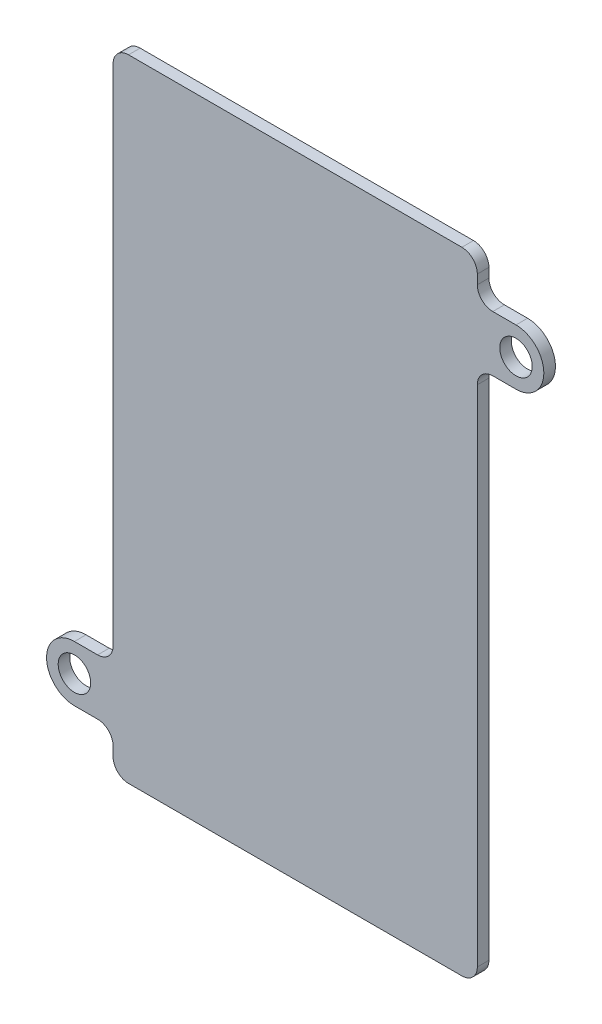
ISO-10303-21;
HEADER;
FILE_DESCRIPTION(('STEP AP214'),'2;1');
FILE_NAME('part.step','',(''),(''),'','','');
FILE_SCHEMA(('AUTOMOTIVE_DESIGN { 1 0 10303 214 1 1 1 1 }'));
ENDSEC;
DATA;
#1=APPLICATION_CONTEXT('core data for automotive mechanical design processes');
#2=APPLICATION_PROTOCOL_DEFINITION('international standard','automotive_design',2000,#1);
#3=PRODUCT_CONTEXT('',#1,'mechanical');
#4=PRODUCT('Part','Part','',(#3));
#5=PRODUCT_RELATED_PRODUCT_CATEGORY('part','',(#4));
#6=PRODUCT_DEFINITION_FORMATION('','',#4);
#7=PRODUCT_DEFINITION_CONTEXT('part definition',#1,'design');
#8=PRODUCT_DEFINITION('design','',#6,#7);
#9=PRODUCT_DEFINITION_SHAPE('','',#8);
#10=(LENGTH_UNIT() NAMED_UNIT(*) SI_UNIT(.MILLI.,.METRE.));
#11=(NAMED_UNIT(*) PLANE_ANGLE_UNIT() SI_UNIT($,.RADIAN.));
#12=(NAMED_UNIT(*) SI_UNIT($,.STERADIAN.) SOLID_ANGLE_UNIT());
#13=UNCERTAINTY_MEASURE_WITH_UNIT(LENGTH_MEASURE(1.E-05),#10,'distance_accuracy_value','');
#14=(GEOMETRIC_REPRESENTATION_CONTEXT(3) GLOBAL_UNCERTAINTY_ASSIGNED_CONTEXT((#13)) GLOBAL_UNIT_ASSIGNED_CONTEXT((#10,
#11,#12)) REPRESENTATION_CONTEXT('',''));
#15=CARTESIAN_POINT('',(0.,0.,0.));
#16=DIRECTION('',(0.,0.,1.));
#17=DIRECTION('',(1.,0.,0.));
#18=AXIS2_PLACEMENT_3D('',#15,#16,#17);
#19=CARTESIAN_POINT('',(28.55,32.,-1.5));
#20=DIRECTION('',(0.,0.,1.));
#21=DIRECTION('',(1.,0.,0.));
#22=AXIS2_PLACEMENT_3D('',#19,#20,#21);
#23=CYLINDRICAL_SURFACE('',#22,2.1);
#24=CARTESIAN_POINT('',(28.55,32.,-1.5));
#25=DIRECTION('',(0.,0.,1.));
#26=DIRECTION('',(1.,0.,0.));
#27=AXIS2_PLACEMENT_3D('',#24,#25,#26);
#28=CIRCLE('',#27,2.1);
#29=CARTESIAN_POINT('',(30.65,32.,-1.5));
#30=VERTEX_POINT('',#29);
#31=EDGE_CURVE('E270',#30,#30,#28,.F.);
#32=ORIENTED_EDGE('',*,*,#31,.T.);
#33=EDGE_LOOP('',(#32));
#34=FACE_BOUND('',#33,.T.);
#35=CARTESIAN_POINT('',(28.55,32.,0.));
#36=DIRECTION('',(0.,0.,1.));
#37=DIRECTION('',(1.,0.,0.));
#38=AXIS2_PLACEMENT_3D('',#35,#36,#37);
#39=CIRCLE('',#38,2.1);
#40=CARTESIAN_POINT('',(30.65,32.,0.));
#41=VERTEX_POINT('',#40);
#42=EDGE_CURVE('E327',#41,#41,#39,.F.);
#43=ORIENTED_EDGE('',*,*,#42,.F.);
#44=EDGE_LOOP('',(#43));
#45=FACE_BOUND('',#44,.T.);
#46=ADVANCED_FACE('F121',(#34,#45),#23,.F.);
#47=CARTESIAN_POINT('',(23.55,0.,-1.5));
#48=DIRECTION('',(1.,0.,0.));
#49=DIRECTION('',(0.,0.,-1.));
#50=AXIS2_PLACEMENT_3D('',#47,#48,#49);
#51=PLANE('',#50);
#52=DIRECTION('',(0.,1.,0.));
#53=VECTOR('',#52,1.);
#54=CARTESIAN_POINT('',(23.55,0.,0.));
#55=LINE('',#54,#53);
#56=CARTESIAN_POINT('',(23.55,37.6,0.));
#57=VERTEX_POINT('',#56);
#58=CARTESIAN_POINT('',(23.55,38.8,0.));
#59=VERTEX_POINT('',#58);
#60=EDGE_CURVE('E324',#57,#59,#55,.T.);
#61=ORIENTED_EDGE('',*,*,#60,.F.);
#62=DIRECTION('',(0.,0.,1.));
#63=VECTOR('',#62,1.);
#64=CARTESIAN_POINT('',(23.55,37.6,-1.5));
#65=LINE('',#64,#63);
#66=CARTESIAN_POINT('',(23.55,37.6,-1.5));
#67=VERTEX_POINT('',#66);
#68=EDGE_CURVE('E370',#57,#67,#65,.F.);
#69=ORIENTED_EDGE('',*,*,#68,.T.);
#70=DIRECTION('',(0.,1.,0.));
#71=VECTOR('',#70,1.);
#72=CARTESIAN_POINT('',(23.55,0.,-1.5));
#73=LINE('',#72,#71);
#74=CARTESIAN_POINT('',(23.55,38.8,-1.5));
#75=VERTEX_POINT('',#74);
#76=EDGE_CURVE('E297',#67,#75,#73,.T.);
#77=ORIENTED_EDGE('',*,*,#76,.T.);
#78=DIRECTION('',(0.,0.,1.));
#79=VECTOR('',#78,1.);
#80=CARTESIAN_POINT('',(23.55,38.8,-1.5));
#81=LINE('',#80,#79);
#82=EDGE_CURVE('E367',#75,#59,#81,.T.);
#83=ORIENTED_EDGE('',*,*,#82,.T.);
#84=EDGE_LOOP('',(#61,#69,#77,#83));
#85=FACE_BOUND('',#84,.T.);
#86=ADVANCED_FACE('F453',(#85),#51,.T.);
#87=CARTESIAN_POINT('',(0.,35.6,-1.5));
#88=DIRECTION('',(0.,1.,0.));
#89=DIRECTION('',(0.,0.,1.));
#90=AXIS2_PLACEMENT_3D('',#87,#88,#89);
#91=PLANE('',#90);
#92=DIRECTION('',(-1.,0.,0.));
#93=VECTOR('',#92,1.);
#94=CARTESIAN_POINT('',(0.,35.6,-1.5));
#95=LINE('',#94,#93);
#96=CARTESIAN_POINT('',(28.55,35.6,-1.5));
#97=VERTEX_POINT('',#96);
#98=CARTESIAN_POINT('',(25.55,35.6,-1.5));
#99=VERTEX_POINT('',#98);
#100=EDGE_CURVE('E300',#97,#99,#95,.T.);
#101=ORIENTED_EDGE('',*,*,#100,.T.);
#102=DIRECTION('',(0.,0.,1.));
#103=VECTOR('',#102,1.);
#104=CARTESIAN_POINT('',(25.55,35.6,0.));
#105=LINE('',#104,#103);
#106=CARTESIAN_POINT('',(25.55,35.6,0.));
#107=VERTEX_POINT('',#106);
#108=EDGE_CURVE('E364',#99,#107,#105,.T.);
#109=ORIENTED_EDGE('',*,*,#108,.T.);
#110=DIRECTION('',(-1.,0.,0.));
#111=VECTOR('',#110,1.);
#112=CARTESIAN_POINT('',(0.,35.6,0.));
#113=LINE('',#112,#111);
#114=CARTESIAN_POINT('',(28.55,35.6,0.));
#115=VERTEX_POINT('',#114);
#116=EDGE_CURVE('E328',#115,#107,#113,.T.);
#117=ORIENTED_EDGE('',*,*,#116,.F.);
#118=DIRECTION('',(0.,0.,1.));
#119=VECTOR('',#118,1.);
#120=CARTESIAN_POINT('',(28.55,35.6,-1.5));
#121=LINE('',#120,#119);
#122=EDGE_CURVE('E338',#97,#115,#121,.T.);
#123=ORIENTED_EDGE('',*,*,#122,.F.);
#124=EDGE_LOOP('',(#101,#109,#117,#123));
#125=FACE_BOUND('',#124,.T.);
#126=ADVANCED_FACE('F460',(#125),#91,.T.);
#127=CARTESIAN_POINT('',(28.55,32.,-1.5));
#128=DIRECTION('',(0.,0.,1.));
#129=DIRECTION('',(1.,0.,0.));
#130=AXIS2_PLACEMENT_3D('',#127,#128,#129);
#131=CYLINDRICAL_SURFACE('',#130,3.6);
#132=CARTESIAN_POINT('',(28.55,32.,0.));
#133=DIRECTION('',(0.,0.,1.));
#134=DIRECTION('',(1.,0.,0.));
#135=AXIS2_PLACEMENT_3D('',#132,#133,#134);
#136=CIRCLE('',#135,3.6);
#137=CARTESIAN_POINT('',(28.55,28.4,0.));
#138=VERTEX_POINT('',#137);
#139=EDGE_CURVE('E332',#115,#138,#136,.F.);
#140=ORIENTED_EDGE('',*,*,#139,.T.);
#141=DIRECTION('',(0.,0.,1.));
#142=VECTOR('',#141,1.);
#143=CARTESIAN_POINT('',(28.55,28.4,-1.5));
#144=LINE('',#143,#142);
#145=CARTESIAN_POINT('',(28.55,28.4,-1.5));
#146=VERTEX_POINT('',#145);
#147=EDGE_CURVE('E341',#146,#138,#144,.T.);
#148=ORIENTED_EDGE('',*,*,#147,.F.);
#149=CARTESIAN_POINT('',(28.55,32.,-1.5));
#150=DIRECTION('',(0.,0.,1.));
#151=DIRECTION('',(1.,0.,0.));
#152=AXIS2_PLACEMENT_3D('',#149,#150,#151);
#153=CIRCLE('',#152,3.6);
#154=EDGE_CURVE('E304',#97,#146,#153,.F.);
#155=ORIENTED_EDGE('',*,*,#154,.F.);
#156=ORIENTED_EDGE('',*,*,#122,.T.);
#157=EDGE_LOOP('',(#140,#148,#155,#156));
#158=FACE_BOUND('',#157,.T.);
#159=ADVANCED_FACE('F466',(#158),#131,.T.);
#160=CARTESIAN_POINT('',(0.,28.4,-1.5));
#161=DIRECTION('',(0.,1.,0.));
#162=DIRECTION('',(0.,0.,1.));
#163=AXIS2_PLACEMENT_3D('',#160,#161,#162);
#164=PLANE('',#163);
#165=DIRECTION('',(-1.,0.,0.));
#166=VECTOR('',#165,1.);
#167=CARTESIAN_POINT('',(0.,28.4,0.));
#168=LINE('',#167,#166);
#169=CARTESIAN_POINT('',(25.55,28.4,0.));
#170=VERTEX_POINT('',#169);
#171=EDGE_CURVE('E329',#138,#170,#168,.T.);
#172=ORIENTED_EDGE('',*,*,#171,.T.);
#173=DIRECTION('',(0.,0.,1.));
#174=VECTOR('',#173,1.);
#175=CARTESIAN_POINT('',(25.55,28.4,-1.5));
#176=LINE('',#175,#174);
#177=CARTESIAN_POINT('',(25.55,28.4,-1.5));
#178=VERTEX_POINT('',#177);
#179=EDGE_CURVE('E356',#170,#178,#176,.F.);
#180=ORIENTED_EDGE('',*,*,#179,.T.);
#181=DIRECTION('',(-1.,0.,0.));
#182=VECTOR('',#181,1.);
#183=CARTESIAN_POINT('',(0.,28.4,-1.5));
#184=LINE('',#183,#182);
#185=EDGE_CURVE('E301',#146,#178,#184,.T.);
#186=ORIENTED_EDGE('',*,*,#185,.F.);
#187=ORIENTED_EDGE('',*,*,#147,.T.);
#188=EDGE_LOOP('',(#172,#180,#186,#187));
#189=FACE_BOUND('',#188,.T.);
#190=ADVANCED_FACE('F515',(#189),#164,.F.);
#191=CARTESIAN_POINT('',(23.55,-38.8,-1.5));
#192=VERTEX_POINT('',#191);
#193=CARTESIAN_POINT('',(23.55,26.4,-1.5));
#194=VERTEX_POINT('',#193);
#195=EDGE_CURVE('E296',#192,#194,#73,.T.);
#196=ORIENTED_EDGE('',*,*,#195,.T.);
#197=DIRECTION('',(0.,0.,1.));
#198=VECTOR('',#197,1.);
#199=CARTESIAN_POINT('',(23.55,26.4,-1.5));
#200=LINE('',#199,#198);
#201=CARTESIAN_POINT('',(23.55,26.4,0.));
#202=VERTEX_POINT('',#201);
#203=EDGE_CURVE('E353',#194,#202,#200,.T.);
#204=ORIENTED_EDGE('',*,*,#203,.T.);
#205=CARTESIAN_POINT('',(23.55,-38.8,0.));
#206=VERTEX_POINT('',#205);
#207=EDGE_CURVE('E323',#206,#202,#55,.T.);
#208=ORIENTED_EDGE('',*,*,#207,.F.);
#209=DIRECTION('',(0.,0.,1.));
#210=VECTOR('',#209,1.);
#211=CARTESIAN_POINT('',(23.55,-38.8,-1.5));
#212=LINE('',#211,#210);
#213=EDGE_CURVE('E340',#206,#192,#212,.F.);
#214=ORIENTED_EDGE('',*,*,#213,.T.);
#215=EDGE_LOOP('',(#196,#204,#208,#214));
#216=FACE_BOUND('',#215,.T.);
#217=ADVANCED_FACE('F479',(#216),#51,.T.);
#218=CARTESIAN_POINT('',(0.,-40.8,-1.5));
#219=DIRECTION('',(0.,1.,0.));
#220=DIRECTION('',(0.,0.,1.));
#221=AXIS2_PLACEMENT_3D('',#218,#219,#220);
#222=PLANE('',#221);
#223=DIRECTION('',(-1.,0.,0.));
#224=VECTOR('',#223,1.);
#225=CARTESIAN_POINT('',(0.,-40.8,-1.5));
#226=LINE('',#225,#224);
#227=CARTESIAN_POINT('',(21.55,-40.8,-1.5));
#228=VERTEX_POINT('',#227);
#229=CARTESIAN_POINT('',(-21.55,-40.8,-1.5));
#230=VERTEX_POINT('',#229);
#231=EDGE_CURVE('E293',#228,#230,#226,.T.);
#232=ORIENTED_EDGE('',*,*,#231,.F.);
#233=DIRECTION('',(0.,0.,1.));
#234=VECTOR('',#233,1.);
#235=CARTESIAN_POINT('',(21.55,-40.8,0.));
#236=LINE('',#235,#234);
#237=CARTESIAN_POINT('',(21.55,-40.8,0.));
#238=VERTEX_POINT('',#237);
#239=EDGE_CURVE('E395',#228,#238,#236,.T.);
#240=ORIENTED_EDGE('',*,*,#239,.T.);
#241=DIRECTION('',(-1.,0.,0.));
#242=VECTOR('',#241,1.);
#243=CARTESIAN_POINT('',(0.,-40.8,0.));
#244=LINE('',#243,#242);
#245=CARTESIAN_POINT('',(-21.55,-40.8,0.));
#246=VERTEX_POINT('',#245);
#247=EDGE_CURVE('E315',#238,#246,#244,.T.);
#248=ORIENTED_EDGE('',*,*,#247,.T.);
#249=DIRECTION('',(0.,0.,1.));
#250=VECTOR('',#249,1.);
#251=CARTESIAN_POINT('',(-21.55,-40.8,-1.5));
#252=LINE('',#251,#250);
#253=EDGE_CURVE('E393',#246,#230,#252,.F.);
#254=ORIENTED_EDGE('',*,*,#253,.T.);
#255=EDGE_LOOP('',(#232,#240,#248,#254));
#256=FACE_BOUND('',#255,.T.);
#257=ADVANCED_FACE('F489',(#256),#222,.F.);
#258=CARTESIAN_POINT('',(-23.55,0.,-1.5));
#259=DIRECTION('',(1.,0.,0.));
#260=DIRECTION('',(0.,0.,-1.));
#261=AXIS2_PLACEMENT_3D('',#258,#259,#260);
#262=PLANE('',#261);
#263=DIRECTION('',(0.,1.,0.));
#264=VECTOR('',#263,1.);
#265=CARTESIAN_POINT('',(-23.55,0.,-1.5));
#266=LINE('',#265,#264);
#267=CARTESIAN_POINT('',(-23.55,-38.8,-1.5));
#268=VERTEX_POINT('',#267);
#269=CARTESIAN_POINT('',(-23.55,-37.6,-1.5));
#270=VERTEX_POINT('',#269);
#271=EDGE_CURVE('E286',#268,#270,#266,.T.);
#272=ORIENTED_EDGE('',*,*,#271,.F.);
#273=DIRECTION('',(0.,0.,1.));
#274=VECTOR('',#273,1.);
#275=CARTESIAN_POINT('',(-23.55,-38.8,-1.5));
#276=LINE('',#275,#274);
#277=CARTESIAN_POINT('',(-23.55,-38.8,0.));
#278=VERTEX_POINT('',#277);
#279=EDGE_CURVE('E399',#268,#278,#276,.T.);
#280=ORIENTED_EDGE('',*,*,#279,.T.);
#281=DIRECTION('',(0.,1.,0.));
#282=VECTOR('',#281,1.);
#283=CARTESIAN_POINT('',(-23.55,0.,0.));
#284=LINE('',#283,#282);
#285=CARTESIAN_POINT('',(-23.55,-37.6,0.));
#286=VERTEX_POINT('',#285);
#287=EDGE_CURVE('E313',#278,#286,#284,.T.);
#288=ORIENTED_EDGE('',*,*,#287,.T.);
#289=DIRECTION('',(0.,0.,1.));
#290=VECTOR('',#289,1.);
#291=CARTESIAN_POINT('',(-23.55,-37.6,-1.5));
#292=LINE('',#291,#290);
#293=EDGE_CURVE('E142',#286,#270,#292,.F.);
#294=ORIENTED_EDGE('',*,*,#293,.T.);
#295=EDGE_LOOP('',(#272,#280,#288,#294));
#296=FACE_BOUND('',#295,.T.);
#297=ADVANCED_FACE('F423',(#296),#262,.F.);
#298=CARTESIAN_POINT('',(0.,-35.6,-1.5));
#299=DIRECTION('',(0.,-1.,0.));
#300=DIRECTION('',(0.,0.,-1.));
#301=AXIS2_PLACEMENT_3D('',#298,#299,#300);
#302=PLANE('',#301);
#303=DIRECTION('',(1.,0.,0.));
#304=VECTOR('',#303,1.);
#305=CARTESIAN_POINT('',(0.,-35.6,-1.5));
#306=LINE('',#305,#304);
#307=CARTESIAN_POINT('',(-28.55,-35.6,-1.5));
#308=VERTEX_POINT('',#307);
#309=CARTESIAN_POINT('',(-25.55,-35.6,-1.5));
#310=VERTEX_POINT('',#309);
#311=EDGE_CURVE('E278',#308,#310,#306,.T.);
#312=ORIENTED_EDGE('',*,*,#311,.T.);
#313=DIRECTION('',(0.,0.,1.));
#314=VECTOR('',#313,1.);
#315=CARTESIAN_POINT('',(-25.55,-35.6,-1.5));
#316=LINE('',#315,#314);
#317=CARTESIAN_POINT('',(-25.55,-35.6,0.));
#318=VERTEX_POINT('',#317);
#319=EDGE_CURVE('E402',#310,#318,#316,.T.);
#320=ORIENTED_EDGE('',*,*,#319,.T.);
#321=DIRECTION('',(1.,0.,0.));
#322=VECTOR('',#321,1.);
#323=CARTESIAN_POINT('',(0.,-35.6,0.));
#324=LINE('',#323,#322);
#325=CARTESIAN_POINT('',(-28.55,-35.6,0.));
#326=VERTEX_POINT('',#325);
#327=EDGE_CURVE('E316',#326,#318,#324,.T.);
#328=ORIENTED_EDGE('',*,*,#327,.F.);
#329=DIRECTION('',(0.,0.,1.));
#330=VECTOR('',#329,1.);
#331=CARTESIAN_POINT('',(-28.55,-35.6,-1.5));
#332=LINE('',#331,#330);
#333=EDGE_CURVE('E269',#308,#326,#332,.T.);
#334=ORIENTED_EDGE('',*,*,#333,.F.);
#335=EDGE_LOOP('',(#312,#320,#328,#334));
#336=FACE_BOUND('',#335,.T.);
#337=ADVANCED_FACE('F426',(#336),#302,.T.);
#338=CARTESIAN_POINT('',(0.,-28.4,-1.5));
#339=DIRECTION('',(0.,-1.,0.));
#340=DIRECTION('',(0.,0.,-1.));
#341=AXIS2_PLACEMENT_3D('',#338,#339,#340);
#342=PLANE('',#341);
#343=DIRECTION('',(1.,0.,0.));
#344=VECTOR('',#343,1.);
#345=CARTESIAN_POINT('',(0.,-28.4,0.));
#346=LINE('',#345,#344);
#347=CARTESIAN_POINT('',(-28.55,-28.4,0.));
#348=VERTEX_POINT('',#347);
#349=CARTESIAN_POINT('',(-25.55,-28.4,0.));
#350=VERTEX_POINT('',#349);
#351=EDGE_CURVE('E317',#348,#350,#346,.T.);
#352=ORIENTED_EDGE('',*,*,#351,.T.);
#353=DIRECTION('',(0.,0.,1.));
#354=VECTOR('',#353,1.);
#355=CARTESIAN_POINT('',(-25.55,-28.4,-1.5));
#356=LINE('',#355,#354);
#357=CARTESIAN_POINT('',(-25.55,-28.4,-1.5));
#358=VERTEX_POINT('',#357);
#359=EDGE_CURVE('E283',#350,#358,#356,.F.);
#360=ORIENTED_EDGE('',*,*,#359,.T.);
#361=DIRECTION('',(1.,0.,0.));
#362=VECTOR('',#361,1.);
#363=CARTESIAN_POINT('',(0.,-28.4,-1.5));
#364=LINE('',#363,#362);
#365=CARTESIAN_POINT('',(-28.55,-28.4,-1.5));
#366=VERTEX_POINT('',#365);
#367=EDGE_CURVE('E276',#366,#358,#364,.T.);
#368=ORIENTED_EDGE('',*,*,#367,.F.);
#369=DIRECTION('',(0.,0.,1.));
#370=VECTOR('',#369,1.);
#371=CARTESIAN_POINT('',(-28.55,-28.4,-1.5));
#372=LINE('',#371,#370);
#373=EDGE_CURVE('E259',#366,#348,#372,.T.);
#374=ORIENTED_EDGE('',*,*,#373,.T.);
#375=EDGE_LOOP('',(#352,#360,#368,#374));
#376=FACE_BOUND('',#375,.T.);
#377=ADVANCED_FACE('F281',(#376),#342,.F.);
#378=CARTESIAN_POINT('',(-23.55,-26.4,-1.5));
#379=VERTEX_POINT('',#378);
#380=CARTESIAN_POINT('',(-23.55,38.8,-1.5));
#381=VERTEX_POINT('',#380);
#382=EDGE_CURVE('E284',#379,#381,#266,.T.);
#383=ORIENTED_EDGE('',*,*,#382,.F.);
#384=DIRECTION('',(0.,0.,1.));
#385=VECTOR('',#384,1.);
#386=CARTESIAN_POINT('',(-23.55,-26.4,0.));
#387=LINE('',#386,#385);
#388=CARTESIAN_POINT('',(-23.55,-26.4,0.));
#389=VERTEX_POINT('',#388);
#390=EDGE_CURVE('E360',#379,#389,#387,.T.);
#391=ORIENTED_EDGE('',*,*,#390,.T.);
#392=CARTESIAN_POINT('',(-23.55,38.8,0.));
#393=VERTEX_POINT('',#392);
#394=EDGE_CURVE('E312',#389,#393,#284,.T.);
#395=ORIENTED_EDGE('',*,*,#394,.T.);
#396=DIRECTION('',(0.,0.,1.));
#397=VECTOR('',#396,1.);
#398=CARTESIAN_POINT('',(-23.55,38.8,-1.5));
#399=LINE('',#398,#397);
#400=EDGE_CURVE('E358',#393,#381,#399,.F.);
#401=ORIENTED_EDGE('',*,*,#400,.T.);
#402=EDGE_LOOP('',(#383,#391,#395,#401));
#403=FACE_BOUND('',#402,.T.);
#404=ADVANCED_FACE('F434',(#403),#262,.F.);
#405=CARTESIAN_POINT('',(0.,40.8,-1.5));
#406=DIRECTION('',(0.,1.,0.));
#407=DIRECTION('',(0.,0.,1.));
#408=AXIS2_PLACEMENT_3D('',#405,#406,#407);
#409=PLANE('',#408);
#410=DIRECTION('',(-1.,0.,0.));
#411=VECTOR('',#410,1.);
#412=CARTESIAN_POINT('',(0.,40.8,0.));
#413=LINE('',#412,#411);
#414=CARTESIAN_POINT('',(21.55,40.8,0.));
#415=VERTEX_POINT('',#414);
#416=CARTESIAN_POINT('',(-21.55,40.8,0.));
#417=VERTEX_POINT('',#416);
#418=EDGE_CURVE('E279',#415,#417,#413,.T.);
#419=ORIENTED_EDGE('',*,*,#418,.F.);
#420=DIRECTION('',(0.,0.,1.));
#421=VECTOR('',#420,1.);
#422=CARTESIAN_POINT('',(21.55,40.8,-1.5));
#423=LINE('',#422,#421);
#424=CARTESIAN_POINT('',(21.55,40.8,-1.5));
#425=VERTEX_POINT('',#424);
#426=EDGE_CURVE('E383',#415,#425,#423,.F.);
#427=ORIENTED_EDGE('',*,*,#426,.T.);
#428=DIRECTION('',(-1.,0.,0.));
#429=VECTOR('',#428,1.);
#430=CARTESIAN_POINT('',(0.,40.8,-1.5));
#431=LINE('',#430,#429);
#432=CARTESIAN_POINT('',(-21.55,40.8,-1.5));
#433=VERTEX_POINT('',#432);
#434=EDGE_CURVE('E289',#425,#433,#431,.T.);
#435=ORIENTED_EDGE('',*,*,#434,.T.);
#436=DIRECTION('',(0.,0.,1.));
#437=VECTOR('',#436,1.);
#438=CARTESIAN_POINT('',(-21.55,40.8,0.));
#439=LINE('',#438,#437);
#440=EDGE_CURVE('E380',#433,#417,#439,.T.);
#441=ORIENTED_EDGE('',*,*,#440,.T.);
#442=EDGE_LOOP('',(#419,#427,#435,#441));
#443=FACE_BOUND('',#442,.T.);
#444=ADVANCED_FACE('F444',(#443),#409,.T.);
#445=CARTESIAN_POINT('',(0.,0.,0.));
#446=DIRECTION('',(0.,0.,1.));
#447=DIRECTION('',(1.,0.,0.));
#448=AXIS2_PLACEMENT_3D('',#445,#446,#447);
#449=PLANE('',#448);
#450=ORIENTED_EDGE('',*,*,#60,.T.);
#451=CARTESIAN_POINT('',(21.55,38.8,0.));
#452=DIRECTION('',(0.,0.,1.));
#453=DIRECTION('',(1.,0.,0.));
#454=AXIS2_PLACEMENT_3D('',#451,#452,#453);
#455=CIRCLE('',#454,2.);
#456=EDGE_CURVE('E378',#59,#415,#455,.T.);
#457=ORIENTED_EDGE('',*,*,#456,.T.);
#458=ORIENTED_EDGE('',*,*,#418,.T.);
#459=CARTESIAN_POINT('',(-21.55,38.8,0.));
#460=DIRECTION('',(0.,0.,1.));
#461=DIRECTION('',(1.,0.,0.));
#462=AXIS2_PLACEMENT_3D('',#459,#460,#461);
#463=CIRCLE('',#462,2.);
#464=EDGE_CURVE('E376',#417,#393,#463,.T.);
#465=ORIENTED_EDGE('',*,*,#464,.T.);
#466=ORIENTED_EDGE('',*,*,#394,.F.);
#467=CARTESIAN_POINT('',(-25.55,-26.4,0.));
#468=DIRECTION('',(0.,0.,1.));
#469=DIRECTION('',(1.,0.,0.));
#470=AXIS2_PLACEMENT_3D('',#467,#468,#469);
#471=CIRCLE('',#470,2.);
#472=EDGE_CURVE('E409',#389,#350,#471,.F.);
#473=ORIENTED_EDGE('',*,*,#472,.T.);
#474=ORIENTED_EDGE('',*,*,#351,.F.);
#475=CARTESIAN_POINT('',(-28.55,-32.,0.));
#476=DIRECTION('',(0.,0.,-1.));
#477=DIRECTION('',(-1.,0.,0.));
#478=AXIS2_PLACEMENT_3D('',#475,#476,#477);
#479=CIRCLE('',#478,3.60000000000001);
#480=EDGE_CURVE('E264',#326,#348,#479,.T.);
#481=ORIENTED_EDGE('',*,*,#480,.F.);
#482=ORIENTED_EDGE('',*,*,#327,.T.);
#483=CARTESIAN_POINT('',(-25.55,-37.6,0.));
#484=DIRECTION('',(0.,0.,1.));
#485=DIRECTION('',(1.,0.,0.));
#486=AXIS2_PLACEMENT_3D('',#483,#484,#485);
#487=CIRCLE('',#486,2.);
#488=EDGE_CURVE('E129',#318,#286,#487,.F.);
#489=ORIENTED_EDGE('',*,*,#488,.T.);
#490=ORIENTED_EDGE('',*,*,#287,.F.);
#491=CARTESIAN_POINT('',(-21.55,-38.8,0.));
#492=DIRECTION('',(0.,0.,1.));
#493=DIRECTION('',(1.,0.,0.));
#494=AXIS2_PLACEMENT_3D('',#491,#492,#493);
#495=CIRCLE('',#494,2.);
#496=EDGE_CURVE('E372',#278,#246,#495,.T.);
#497=ORIENTED_EDGE('',*,*,#496,.T.);
#498=ORIENTED_EDGE('',*,*,#247,.F.);
#499=CARTESIAN_POINT('',(21.55,-38.8,0.));
#500=DIRECTION('',(0.,0.,1.));
#501=DIRECTION('',(1.,0.,0.));
#502=AXIS2_PLACEMENT_3D('',#499,#500,#501);
#503=CIRCLE('',#502,2.);
#504=EDGE_CURVE('E374',#238,#206,#503,.T.);
#505=ORIENTED_EDGE('',*,*,#504,.T.);
#506=ORIENTED_EDGE('',*,*,#207,.T.);
#507=CARTESIAN_POINT('',(25.55,26.4,0.));
#508=DIRECTION('',(0.,0.,1.));
#509=DIRECTION('',(1.,0.,0.));
#510=AXIS2_PLACEMENT_3D('',#507,#508,#509);
#511=CIRCLE('',#510,2.);
#512=EDGE_CURVE('E405',#202,#170,#511,.F.);
#513=ORIENTED_EDGE('',*,*,#512,.T.);
#514=ORIENTED_EDGE('',*,*,#171,.F.);
#515=ORIENTED_EDGE('',*,*,#139,.F.);
#516=ORIENTED_EDGE('',*,*,#116,.T.);
#517=CARTESIAN_POINT('',(25.55,37.6,0.));
#518=DIRECTION('',(0.,0.,1.));
#519=DIRECTION('',(1.,0.,0.));
#520=AXIS2_PLACEMENT_3D('',#517,#518,#519);
#521=CIRCLE('',#520,2.);
#522=EDGE_CURVE('E413',#107,#57,#521,.F.);
#523=ORIENTED_EDGE('',*,*,#522,.T.);
#524=EDGE_LOOP('',(#450,#457,#458,#465,#466,#473,#474,#481,#482,#489,#490,#497,#498,#505,#506,
#513,#514,#515,#516,#523));
#525=FACE_BOUND('',#524,.T.);
#526=ORIENTED_EDGE('',*,*,#42,.T.);
#527=EDGE_LOOP('',(#526));
#528=FACE_BOUND('',#527,.T.);
#529=CARTESIAN_POINT('',(-28.55,-32.,0.));
#530=DIRECTION('',(0.,0.,-1.));
#531=DIRECTION('',(-1.,0.,0.));
#532=AXIS2_PLACEMENT_3D('',#529,#530,#531);
#533=CIRCLE('',#532,2.09999999999998);
#534=CARTESIAN_POINT('',(-30.65,-32.,0.));
#535=VERTEX_POINT('',#534);
#536=EDGE_CURVE('E348',#535,#535,#533,.T.);
#537=ORIENTED_EDGE('',*,*,#536,.T.);
#538=EDGE_LOOP('',(#537));
#539=FACE_BOUND('',#538,.T.);
#540=ADVANCED_FACE('F418',(#525,#528,#539),#449,.T.);
#541=CARTESIAN_POINT('',(0.,0.,-1.5));
#542=DIRECTION('',(0.,0.,1.));
#543=DIRECTION('',(1.,0.,0.));
#544=AXIS2_PLACEMENT_3D('',#541,#542,#543);
#545=PLANE('',#544);
#546=ORIENTED_EDGE('',*,*,#434,.F.);
#547=CARTESIAN_POINT('',(21.55,38.8,-1.5));
#548=DIRECTION('',(0.,0.,1.));
#549=DIRECTION('',(1.,0.,0.));
#550=AXIS2_PLACEMENT_3D('',#547,#548,#549);
#551=CIRCLE('',#550,2.);
#552=EDGE_CURVE('E391',#425,#75,#551,.F.);
#553=ORIENTED_EDGE('',*,*,#552,.T.);
#554=ORIENTED_EDGE('',*,*,#76,.F.);
#555=CARTESIAN_POINT('',(25.55,37.6,-1.5));
#556=DIRECTION('',(0.,0.,1.));
#557=DIRECTION('',(1.,0.,0.));
#558=AXIS2_PLACEMENT_3D('',#555,#556,#557);
#559=CIRCLE('',#558,2.);
#560=EDGE_CURVE('E415',#67,#99,#559,.T.);
#561=ORIENTED_EDGE('',*,*,#560,.T.);
#562=ORIENTED_EDGE('',*,*,#100,.F.);
#563=ORIENTED_EDGE('',*,*,#154,.T.);
#564=ORIENTED_EDGE('',*,*,#185,.T.);
#565=CARTESIAN_POINT('',(25.55,26.4,-1.5));
#566=DIRECTION('',(0.,0.,1.));
#567=DIRECTION('',(1.,0.,0.));
#568=AXIS2_PLACEMENT_3D('',#565,#566,#567);
#569=CIRCLE('',#568,2.);
#570=EDGE_CURVE('E407',#178,#194,#569,.T.);
#571=ORIENTED_EDGE('',*,*,#570,.T.);
#572=ORIENTED_EDGE('',*,*,#195,.F.);
#573=CARTESIAN_POINT('',(21.55,-38.8,-1.5));
#574=DIRECTION('',(0.,0.,1.));
#575=DIRECTION('',(1.,0.,0.));
#576=AXIS2_PLACEMENT_3D('',#573,#574,#575);
#577=CIRCLE('',#576,2.);
#578=EDGE_CURVE('E387',#192,#228,#577,.F.);
#579=ORIENTED_EDGE('',*,*,#578,.T.);
#580=ORIENTED_EDGE('',*,*,#231,.T.);
#581=CARTESIAN_POINT('',(-21.55,-38.8,-1.5));
#582=DIRECTION('',(0.,0.,1.));
#583=DIRECTION('',(1.,0.,0.));
#584=AXIS2_PLACEMENT_3D('',#581,#582,#583);
#585=CIRCLE('',#584,2.);
#586=EDGE_CURVE('E385',#230,#268,#585,.F.);
#587=ORIENTED_EDGE('',*,*,#586,.T.);
#588=ORIENTED_EDGE('',*,*,#271,.T.);
#589=CARTESIAN_POINT('',(-25.55,-37.6,-1.5));
#590=DIRECTION('',(0.,0.,1.));
#591=DIRECTION('',(1.,0.,0.));
#592=AXIS2_PLACEMENT_3D('',#589,#590,#591);
#593=CIRCLE('',#592,2.);
#594=EDGE_CURVE('E12',#270,#310,#593,.T.);
#595=ORIENTED_EDGE('',*,*,#594,.T.);
#596=ORIENTED_EDGE('',*,*,#311,.F.);
#597=CARTESIAN_POINT('',(-28.55,-32.,-1.5));
#598=DIRECTION('',(0.,0.,-1.));
#599=DIRECTION('',(-1.,0.,0.));
#600=AXIS2_PLACEMENT_3D('',#597,#598,#599);
#601=CIRCLE('',#600,3.60000000000001);
#602=EDGE_CURVE('E262',#308,#366,#601,.T.);
#603=ORIENTED_EDGE('',*,*,#602,.T.);
#604=ORIENTED_EDGE('',*,*,#367,.T.);
#605=CARTESIAN_POINT('',(-25.55,-26.4,-1.5));
#606=DIRECTION('',(0.,0.,1.));
#607=DIRECTION('',(1.,0.,0.));
#608=AXIS2_PLACEMENT_3D('',#605,#606,#607);
#609=CIRCLE('',#608,2.);
#610=EDGE_CURVE('E411',#358,#379,#609,.T.);
#611=ORIENTED_EDGE('',*,*,#610,.T.);
#612=ORIENTED_EDGE('',*,*,#382,.T.);
#613=CARTESIAN_POINT('',(-21.55,38.8,-1.5));
#614=DIRECTION('',(0.,0.,1.));
#615=DIRECTION('',(1.,0.,0.));
#616=AXIS2_PLACEMENT_3D('',#613,#614,#615);
#617=CIRCLE('',#616,2.);
#618=EDGE_CURVE('E389',#381,#433,#617,.F.);
#619=ORIENTED_EDGE('',*,*,#618,.T.);
#620=EDGE_LOOP('',(#546,#553,#554,#561,#562,#563,#564,#571,#572,#579,#580,#587,#588,#595,#596,
#603,#604,#611,#612,#619));
#621=FACE_BOUND('',#620,.T.);
#622=ORIENTED_EDGE('',*,*,#31,.F.);
#623=EDGE_LOOP('',(#622));
#624=FACE_BOUND('',#623,.T.);
#625=CARTESIAN_POINT('',(-28.55,-32.,-1.5));
#626=DIRECTION('',(0.,0.,-1.));
#627=DIRECTION('',(-1.,0.,0.));
#628=AXIS2_PLACEMENT_3D('',#625,#626,#627);
#629=CIRCLE('',#628,2.09999999999998);
#630=CARTESIAN_POINT('',(-30.65,-32.,-1.5));
#631=VERTEX_POINT('',#630);
#632=EDGE_CURVE('E345',#631,#631,#629,.T.);
#633=ORIENTED_EDGE('',*,*,#632,.F.);
#634=EDGE_LOOP('',(#633));
#635=FACE_BOUND('',#634,.T.);
#636=ADVANCED_FACE('F274',(#621,#624,#635),#545,.F.);
#637=CARTESIAN_POINT('',(-28.55,-32.,-1.5));
#638=DIRECTION('',(0.,0.,1.));
#639=DIRECTION('',(1.,0.,0.));
#640=AXIS2_PLACEMENT_3D('',#637,#638,#639);
#641=CYLINDRICAL_SURFACE('',#640,2.09999999999998);
#642=ORIENTED_EDGE('',*,*,#632,.T.);
#643=EDGE_LOOP('',(#642));
#644=FACE_BOUND('',#643,.T.);
#645=ORIENTED_EDGE('',*,*,#536,.F.);
#646=EDGE_LOOP('',(#645));
#647=FACE_BOUND('',#646,.T.);
#648=ADVANCED_FACE('F528',(#644,#647),#641,.F.);
#649=CARTESIAN_POINT('',(-28.55,-32.,-1.5));
#650=DIRECTION('',(0.,0.,1.));
#651=DIRECTION('',(1.,0.,0.));
#652=AXIS2_PLACEMENT_3D('',#649,#650,#651);
#653=CYLINDRICAL_SURFACE('',#652,3.60000000000001);
#654=ORIENTED_EDGE('',*,*,#333,.T.);
#655=ORIENTED_EDGE('',*,*,#480,.T.);
#656=ORIENTED_EDGE('',*,*,#373,.F.);
#657=ORIENTED_EDGE('',*,*,#602,.F.);
#658=EDGE_LOOP('',(#654,#655,#656,#657));
#659=FACE_BOUND('',#658,.T.);
#660=ADVANCED_FACE('F261',(#659),#653,.T.);
#661=CARTESIAN_POINT('',(25.55,26.4,-1.5));
#662=DIRECTION('',(0.,0.,1.));
#663=DIRECTION('',(1.,0.,0.));
#664=AXIS2_PLACEMENT_3D('',#661,#662,#663);
#665=CYLINDRICAL_SURFACE('',#664,2.);
#666=ORIENTED_EDGE('',*,*,#570,.F.);
#667=ORIENTED_EDGE('',*,*,#179,.F.);
#668=ORIENTED_EDGE('',*,*,#512,.F.);
#669=ORIENTED_EDGE('',*,*,#203,.F.);
#670=EDGE_LOOP('',(#666,#667,#668,#669));
#671=FACE_BOUND('',#670,.T.);
#672=ADVANCED_FACE('F475',(#671),#665,.F.);
#673=CARTESIAN_POINT('',(-25.55,-26.4,-1.5));
#674=DIRECTION('',(0.,0.,-1.));
#675=DIRECTION('',(-1.,0.,0.));
#676=AXIS2_PLACEMENT_3D('',#673,#674,#675);
#677=CYLINDRICAL_SURFACE('',#676,2.);
#678=ORIENTED_EDGE('',*,*,#610,.F.);
#679=ORIENTED_EDGE('',*,*,#359,.F.);
#680=ORIENTED_EDGE('',*,*,#472,.F.);
#681=ORIENTED_EDGE('',*,*,#390,.F.);
#682=EDGE_LOOP('',(#678,#679,#680,#681));
#683=FACE_BOUND('',#682,.T.);
#684=ADVANCED_FACE('F429',(#683),#677,.F.);
#685=CARTESIAN_POINT('',(25.55,37.6,-1.5));
#686=DIRECTION('',(0.,0.,-1.));
#687=DIRECTION('',(-1.,0.,0.));
#688=AXIS2_PLACEMENT_3D('',#685,#686,#687);
#689=CYLINDRICAL_SURFACE('',#688,2.);
#690=ORIENTED_EDGE('',*,*,#560,.F.);
#691=ORIENTED_EDGE('',*,*,#68,.F.);
#692=ORIENTED_EDGE('',*,*,#522,.F.);
#693=ORIENTED_EDGE('',*,*,#108,.F.);
#694=EDGE_LOOP('',(#690,#691,#692,#693));
#695=FACE_BOUND('',#694,.T.);
#696=ADVANCED_FACE('F456',(#695),#689,.F.);
#697=CARTESIAN_POINT('',(21.55,38.8,-1.5));
#698=DIRECTION('',(0.,0.,1.));
#699=DIRECTION('',(1.,0.,0.));
#700=AXIS2_PLACEMENT_3D('',#697,#698,#699);
#701=CYLINDRICAL_SURFACE('',#700,2.);
#702=ORIENTED_EDGE('',*,*,#552,.F.);
#703=ORIENTED_EDGE('',*,*,#426,.F.);
#704=ORIENTED_EDGE('',*,*,#456,.F.);
#705=ORIENTED_EDGE('',*,*,#82,.F.);
#706=EDGE_LOOP('',(#702,#703,#704,#705));
#707=FACE_BOUND('',#706,.T.);
#708=ADVANCED_FACE('F447',(#707),#701,.T.);
#709=CARTESIAN_POINT('',(-21.55,38.8,-1.5));
#710=DIRECTION('',(0.,0.,-1.));
#711=DIRECTION('',(-1.,0.,0.));
#712=AXIS2_PLACEMENT_3D('',#709,#710,#711);
#713=CYLINDRICAL_SURFACE('',#712,2.);
#714=ORIENTED_EDGE('',*,*,#618,.F.);
#715=ORIENTED_EDGE('',*,*,#400,.F.);
#716=ORIENTED_EDGE('',*,*,#464,.F.);
#717=ORIENTED_EDGE('',*,*,#440,.F.);
#718=EDGE_LOOP('',(#714,#715,#716,#717));
#719=FACE_BOUND('',#718,.T.);
#720=ADVANCED_FACE('F438',(#719),#713,.T.);
#721=CARTESIAN_POINT('',(21.55,-38.8,-1.5));
#722=DIRECTION('',(0.,0.,-1.));
#723=DIRECTION('',(-1.,0.,0.));
#724=AXIS2_PLACEMENT_3D('',#721,#722,#723);
#725=CYLINDRICAL_SURFACE('',#724,2.);
#726=ORIENTED_EDGE('',*,*,#578,.F.);
#727=ORIENTED_EDGE('',*,*,#213,.F.);
#728=ORIENTED_EDGE('',*,*,#504,.F.);
#729=ORIENTED_EDGE('',*,*,#239,.F.);
#730=EDGE_LOOP('',(#726,#727,#728,#729));
#731=FACE_BOUND('',#730,.T.);
#732=ADVANCED_FACE('F486',(#731),#725,.T.);
#733=CARTESIAN_POINT('',(-21.55,-38.8,-1.5));
#734=DIRECTION('',(0.,0.,1.));
#735=DIRECTION('',(1.,0.,0.));
#736=AXIS2_PLACEMENT_3D('',#733,#734,#735);
#737=CYLINDRICAL_SURFACE('',#736,2.);
#738=ORIENTED_EDGE('',*,*,#586,.F.);
#739=ORIENTED_EDGE('',*,*,#253,.F.);
#740=ORIENTED_EDGE('',*,*,#496,.F.);
#741=ORIENTED_EDGE('',*,*,#279,.F.);
#742=EDGE_LOOP('',(#738,#739,#740,#741));
#743=FACE_BOUND('',#742,.T.);
#744=ADVANCED_FACE('F493',(#743),#737,.T.);
#745=CARTESIAN_POINT('',(-25.55,-37.6,-1.5));
#746=DIRECTION('',(0.,0.,1.));
#747=DIRECTION('',(1.,0.,0.));
#748=AXIS2_PLACEMENT_3D('',#745,#746,#747);
#749=CYLINDRICAL_SURFACE('',#748,2.);
#750=ORIENTED_EDGE('',*,*,#594,.F.);
#751=ORIENTED_EDGE('',*,*,#293,.F.);
#752=ORIENTED_EDGE('',*,*,#488,.F.);
#753=ORIENTED_EDGE('',*,*,#319,.F.);
#754=EDGE_LOOP('',(#750,#751,#752,#753));
#755=FACE_BOUND('',#754,.T.);
#756=ADVANCED_FACE('F123',(#755),#749,.F.);
#757=CLOSED_SHELL('',(#46,#86,#126,#159,#190,#217,#257,#297,#337,#377,#404,#444,#540,#636,#648,
#660,#672,#684,#696,#708,#720,#732,#744,#756));
#758=MANIFOLD_SOLID_BREP('B2',#757);
#759=ADVANCED_BREP_SHAPE_REPRESENTATION('',(#18,#758),#14);
#760=SHAPE_DEFINITION_REPRESENTATION(#9,#759);
ENDSEC;
END-ISO-10303-21;
